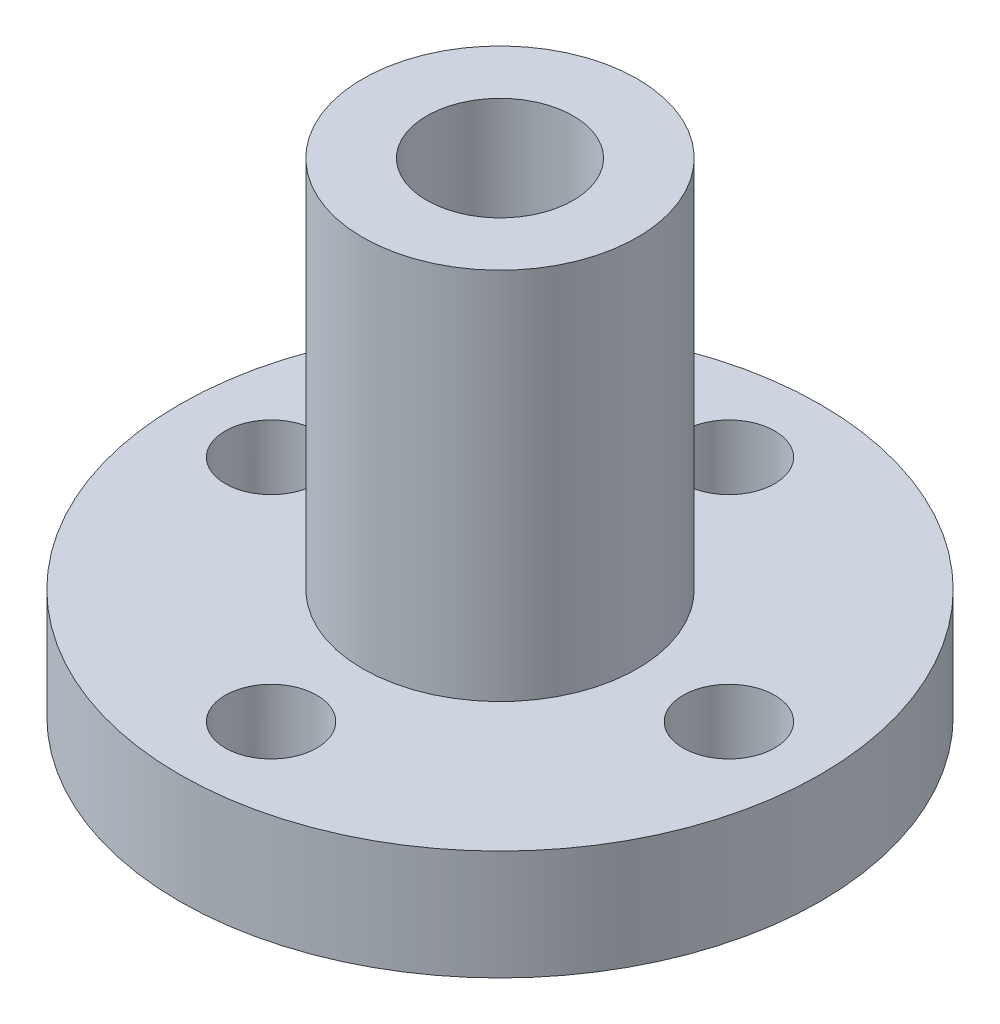
ISO-10303-21;
HEADER;
FILE_DESCRIPTION(('STEP AP214'),'2;1');
FILE_NAME('part.step','',(''),(''),'','','');
FILE_SCHEMA(('AUTOMOTIVE_DESIGN { 1 0 10303 214 1 1 1 1 }'));
ENDSEC;
DATA;
#1=APPLICATION_CONTEXT('core data for automotive mechanical design processes');
#2=APPLICATION_PROTOCOL_DEFINITION('international standard','automotive_design',2000,#1);
#3=PRODUCT_CONTEXT('',#1,'mechanical');
#4=PRODUCT('Part','Part','',(#3));
#5=PRODUCT_RELATED_PRODUCT_CATEGORY('part','',(#4));
#6=PRODUCT_DEFINITION_FORMATION('','',#4);
#7=PRODUCT_DEFINITION_CONTEXT('part definition',#1,'design');
#8=PRODUCT_DEFINITION('design','',#6,#7);
#9=PRODUCT_DEFINITION_SHAPE('','',#8);
#10=(LENGTH_UNIT() NAMED_UNIT(*) SI_UNIT(.MILLI.,.METRE.));
#11=(NAMED_UNIT(*) PLANE_ANGLE_UNIT() SI_UNIT($,.RADIAN.));
#12=(NAMED_UNIT(*) SI_UNIT($,.STERADIAN.) SOLID_ANGLE_UNIT());
#13=UNCERTAINTY_MEASURE_WITH_UNIT(LENGTH_MEASURE(1.E-05),#10,'distance_accuracy_value','');
#14=(GEOMETRIC_REPRESENTATION_CONTEXT(3) GLOBAL_UNCERTAINTY_ASSIGNED_CONTEXT((#13)) GLOBAL_UNIT_ASSIGNED_CONTEXT((#10,
#11,#12)) REPRESENTATION_CONTEXT('',''));
#15=CARTESIAN_POINT('',(0.,0.,0.));
#16=DIRECTION('',(0.,0.,1.));
#17=DIRECTION('',(1.,0.,0.));
#18=AXIS2_PLACEMENT_3D('',#15,#16,#17);
#19=CARTESIAN_POINT('',(0.,6.,0.));
#20=DIRECTION('',(0.,-1.,0.));
#21=DIRECTION('',(0.,0.,-1.));
#22=AXIS2_PLACEMENT_3D('',#19,#20,#21);
#23=CYLINDRICAL_SURFACE('',#22,17.5);
#24=CARTESIAN_POINT('',(0.,6.,0.));
#25=DIRECTION('',(0.,1.,0.));
#26=DIRECTION('',(0.,0.,1.));
#27=AXIS2_PLACEMENT_3D('',#24,#25,#26);
#28=CIRCLE('',#27,17.5);
#29=CARTESIAN_POINT('',(0.,6.,17.5));
#30=VERTEX_POINT('',#29);
#31=EDGE_CURVE('E46',#30,#30,#28,.T.);
#32=ORIENTED_EDGE('',*,*,#31,.F.);
#33=EDGE_LOOP('',(#32));
#34=FACE_BOUND('',#33,.T.);
#35=CARTESIAN_POINT('',(0.,0.,0.));
#36=DIRECTION('',(0.,1.,0.));
#37=DIRECTION('',(0.,0.,1.));
#38=AXIS2_PLACEMENT_3D('',#35,#36,#37);
#39=CIRCLE('',#38,17.5);
#40=CARTESIAN_POINT('',(0.,0.,17.5));
#41=VERTEX_POINT('',#40);
#42=EDGE_CURVE('E51',#41,#41,#39,.T.);
#43=ORIENTED_EDGE('',*,*,#42,.T.);
#44=EDGE_LOOP('',(#43));
#45=FACE_BOUND('',#44,.T.);
#46=ADVANCED_FACE('F39',(#34,#45),#23,.T.);
#47=CARTESIAN_POINT('',(0.,6.,0.));
#48=DIRECTION('',(0.,1.,0.));
#49=DIRECTION('',(0.,0.,1.));
#50=AXIS2_PLACEMENT_3D('',#47,#48,#49);
#51=PLANE('',#50);
#52=CARTESIAN_POINT('',(-12.5,6.,0.));
#53=DIRECTION('',(0.,1.,0.));
#54=DIRECTION('',(1.,0.,0.));
#55=AXIS2_PLACEMENT_3D('',#52,#53,#54);
#56=CIRCLE('',#55,2.5);
#57=CARTESIAN_POINT('',(-10.,6.,0.));
#58=VERTEX_POINT('',#57);
#59=EDGE_CURVE('E70',#58,#58,#56,.T.);
#60=ORIENTED_EDGE('',*,*,#59,.F.);
#61=EDGE_LOOP('',(#60));
#62=FACE_BOUND('',#61,.T.);
#63=CARTESIAN_POINT('',(0.,6.,12.5));
#64=DIRECTION('',(0.,1.,0.));
#65=DIRECTION('',(0.,0.,-1.));
#66=AXIS2_PLACEMENT_3D('',#63,#64,#65);
#67=CIRCLE('',#66,2.5);
#68=CARTESIAN_POINT('',(0.,6.,10.));
#69=VERTEX_POINT('',#68);
#70=EDGE_CURVE('E123',#69,#69,#67,.T.);
#71=ORIENTED_EDGE('',*,*,#70,.F.);
#72=EDGE_LOOP('',(#71));
#73=FACE_BOUND('',#72,.T.);
#74=CARTESIAN_POINT('',(12.5,6.,-1.30930550206618E-13));
#75=DIRECTION('',(0.,1.,0.));
#76=DIRECTION('',(-1.,0.,0.));
#77=AXIS2_PLACEMENT_3D('',#74,#75,#76);
#78=CIRCLE('',#77,2.5);
#79=CARTESIAN_POINT('',(10.,6.,-1.04744440165294E-13));
#80=VERTEX_POINT('',#79);
#81=EDGE_CURVE('E78',#80,#80,#78,.T.);
#82=ORIENTED_EDGE('',*,*,#81,.F.);
#83=EDGE_LOOP('',(#82));
#84=FACE_BOUND('',#83,.T.);
#85=CARTESIAN_POINT('',(0.,6.,-12.5));
#86=DIRECTION('',(0.,1.,0.));
#87=DIRECTION('',(0.,0.,1.));
#88=AXIS2_PLACEMENT_3D('',#85,#86,#87);
#89=CIRCLE('',#88,2.5);
#90=CARTESIAN_POINT('',(0.,6.,-10.));
#91=VERTEX_POINT('',#90);
#92=EDGE_CURVE('E64',#91,#91,#89,.T.);
#93=ORIENTED_EDGE('',*,*,#92,.F.);
#94=EDGE_LOOP('',(#93));
#95=FACE_BOUND('',#94,.T.);
#96=CARTESIAN_POINT('',(0.,6.,0.));
#97=DIRECTION('',(0.,1.,0.));
#98=DIRECTION('',(0.,0.,1.));
#99=AXIS2_PLACEMENT_3D('',#96,#97,#98);
#100=CIRCLE('',#99,7.5);
#101=CARTESIAN_POINT('',(0.,6.,7.5));
#102=VERTEX_POINT('',#101);
#103=EDGE_CURVE('E10',#102,#102,#100,.T.);
#104=ORIENTED_EDGE('',*,*,#103,.F.);
#105=EDGE_LOOP('',(#104));
#106=FACE_BOUND('',#105,.T.);
#107=ORIENTED_EDGE('',*,*,#31,.T.);
#108=EDGE_LOOP('',(#107));
#109=FACE_BOUND('',#108,.T.);
#110=ADVANCED_FACE('F104',(#62,#73,#84,#95,#106,#109),#51,.T.);
#111=CARTESIAN_POINT('',(0.,0.,0.));
#112=DIRECTION('',(0.,1.,0.));
#113=DIRECTION('',(0.,0.,1.));
#114=AXIS2_PLACEMENT_3D('',#111,#112,#113);
#115=PLANE('',#114);
#116=CARTESIAN_POINT('',(-12.5,0.,0.));
#117=DIRECTION('',(0.,1.,0.));
#118=DIRECTION('',(0.,0.,1.));
#119=AXIS2_PLACEMENT_3D('',#116,#117,#118);
#120=CIRCLE('',#119,2.5);
#121=CARTESIAN_POINT('',(-12.5,0.,2.50000000000004));
#122=VERTEX_POINT('',#121);
#123=EDGE_CURVE('E45',#122,#122,#120,.T.);
#124=ORIENTED_EDGE('',*,*,#123,.T.);
#125=EDGE_LOOP('',(#124));
#126=FACE_BOUND('',#125,.T.);
#127=CARTESIAN_POINT('',(0.,0.,12.5));
#128=DIRECTION('',(0.,1.,0.));
#129=DIRECTION('',(0.,0.,1.));
#130=AXIS2_PLACEMENT_3D('',#127,#128,#129);
#131=CIRCLE('',#130,2.5);
#132=CARTESIAN_POINT('',(0.,0.,15.));
#133=VERTEX_POINT('',#132);
#134=EDGE_CURVE('E66',#133,#133,#131,.T.);
#135=ORIENTED_EDGE('',*,*,#134,.T.);
#136=EDGE_LOOP('',(#135));
#137=FACE_BOUND('',#136,.T.);
#138=CARTESIAN_POINT('',(12.5,0.,-1.30930550206618E-13));
#139=DIRECTION('',(0.,1.,0.));
#140=DIRECTION('',(0.,0.,1.));
#141=AXIS2_PLACEMENT_3D('',#138,#139,#140);
#142=CIRCLE('',#141,2.5);
#143=CARTESIAN_POINT('',(12.5,0.,2.49999999999987));
#144=VERTEX_POINT('',#143);
#145=EDGE_CURVE('E61',#144,#144,#142,.T.);
#146=ORIENTED_EDGE('',*,*,#145,.T.);
#147=EDGE_LOOP('',(#146));
#148=FACE_BOUND('',#147,.T.);
#149=CARTESIAN_POINT('',(0.,0.,-12.5));
#150=DIRECTION('',(0.,1.,0.));
#151=DIRECTION('',(0.,0.,1.));
#152=AXIS2_PLACEMENT_3D('',#149,#150,#151);
#153=CIRCLE('',#152,2.5);
#154=CARTESIAN_POINT('',(0.,0.,-10.));
#155=VERTEX_POINT('',#154);
#156=EDGE_CURVE('E56',#155,#155,#153,.T.);
#157=ORIENTED_EDGE('',*,*,#156,.T.);
#158=EDGE_LOOP('',(#157));
#159=FACE_BOUND('',#158,.T.);
#160=CARTESIAN_POINT('',(0.,0.,0.));
#161=DIRECTION('',(0.,1.,0.));
#162=DIRECTION('',(0.,0.,1.));
#163=AXIS2_PLACEMENT_3D('',#160,#161,#162);
#164=CIRCLE('',#163,4.);
#165=CARTESIAN_POINT('',(0.,0.,4.));
#166=VERTEX_POINT('',#165);
#167=EDGE_CURVE('E85',#166,#166,#164,.T.);
#168=ORIENTED_EDGE('',*,*,#167,.T.);
#169=EDGE_LOOP('',(#168));
#170=FACE_BOUND('',#169,.T.);
#171=ORIENTED_EDGE('',*,*,#42,.F.);
#172=EDGE_LOOP('',(#171));
#173=FACE_BOUND('',#172,.T.);
#174=ADVANCED_FACE('F96',(#126,#137,#148,#159,#170,#173),#115,.F.);
#175=CARTESIAN_POINT('',(0.,26.4,0.));
#176=DIRECTION('',(0.,-1.,0.));
#177=DIRECTION('',(0.,0.,-1.));
#178=AXIS2_PLACEMENT_3D('',#175,#176,#177);
#179=CYLINDRICAL_SURFACE('',#178,7.5);
#180=CARTESIAN_POINT('',(0.,26.4,0.));
#181=DIRECTION('',(0.,1.,0.));
#182=DIRECTION('',(0.,0.,1.));
#183=AXIS2_PLACEMENT_3D('',#180,#181,#182);
#184=CIRCLE('',#183,7.5);
#185=CARTESIAN_POINT('',(0.,26.4,7.5));
#186=VERTEX_POINT('',#185);
#187=EDGE_CURVE('E53',#186,#186,#184,.T.);
#188=ORIENTED_EDGE('',*,*,#187,.F.);
#189=EDGE_LOOP('',(#188));
#190=FACE_BOUND('',#189,.T.);
#191=ORIENTED_EDGE('',*,*,#103,.T.);
#192=EDGE_LOOP('',(#191));
#193=FACE_BOUND('',#192,.T.);
#194=ADVANCED_FACE('F95',(#190,#193),#179,.T.);
#195=CARTESIAN_POINT('',(0.,26.4,0.));
#196=DIRECTION('',(0.,1.,0.));
#197=DIRECTION('',(0.,0.,1.));
#198=AXIS2_PLACEMENT_3D('',#195,#196,#197);
#199=PLANE('',#198);
#200=CARTESIAN_POINT('',(0.,26.4,0.));
#201=DIRECTION('',(0.,1.,0.));
#202=DIRECTION('',(0.,0.,1.));
#203=AXIS2_PLACEMENT_3D('',#200,#201,#202);
#204=CIRCLE('',#203,4.);
#205=CARTESIAN_POINT('',(0.,26.4,4.));
#206=VERTEX_POINT('',#205);
#207=EDGE_CURVE('E65',#206,#206,#204,.T.);
#208=ORIENTED_EDGE('',*,*,#207,.F.);
#209=EDGE_LOOP('',(#208));
#210=FACE_BOUND('',#209,.T.);
#211=ORIENTED_EDGE('',*,*,#187,.T.);
#212=EDGE_LOOP('',(#211));
#213=FACE_BOUND('',#212,.T.);
#214=ADVANCED_FACE('F88',(#210,#213),#199,.T.);
#215=CARTESIAN_POINT('',(0.,0.,0.));
#216=DIRECTION('',(0.,1.,0.));
#217=DIRECTION('',(0.,0.,1.));
#218=AXIS2_PLACEMENT_3D('',#215,#216,#217);
#219=CYLINDRICAL_SURFACE('',#218,4.);
#220=ORIENTED_EDGE('',*,*,#167,.F.);
#221=EDGE_LOOP('',(#220));
#222=FACE_BOUND('',#221,.T.);
#223=ORIENTED_EDGE('',*,*,#207,.T.);
#224=EDGE_LOOP('',(#223));
#225=FACE_BOUND('',#224,.T.);
#226=ADVANCED_FACE('F90',(#222,#225),#219,.F.);
#227=CARTESIAN_POINT('',(0.,-4.,-12.5));
#228=DIRECTION('',(0.,1.,0.));
#229=DIRECTION('',(0.,0.,1.));
#230=AXIS2_PLACEMENT_3D('',#227,#228,#229);
#231=CYLINDRICAL_SURFACE('',#230,2.5);
#232=ORIENTED_EDGE('',*,*,#92,.T.);
#233=EDGE_LOOP('',(#232));
#234=FACE_BOUND('',#233,.T.);
#235=ORIENTED_EDGE('',*,*,#156,.F.);
#236=EDGE_LOOP('',(#235));
#237=FACE_BOUND('',#236,.T.);
#238=ADVANCED_FACE('F150',(#234,#237),#231,.F.);
#239=CARTESIAN_POINT('',(12.5,-4.,-1.30930550206618E-13));
#240=DIRECTION('',(0.,1.,0.));
#241=DIRECTION('',(0.,0.,1.));
#242=AXIS2_PLACEMENT_3D('',#239,#240,#241);
#243=CYLINDRICAL_SURFACE('',#242,2.5);
#244=ORIENTED_EDGE('',*,*,#81,.T.);
#245=EDGE_LOOP('',(#244));
#246=FACE_BOUND('',#245,.T.);
#247=ORIENTED_EDGE('',*,*,#145,.F.);
#248=EDGE_LOOP('',(#247));
#249=FACE_BOUND('',#248,.T.);
#250=ADVANCED_FACE('F145',(#246,#249),#243,.F.);
#251=CARTESIAN_POINT('',(0.,-4.,12.5));
#252=DIRECTION('',(0.,1.,0.));
#253=DIRECTION('',(0.,0.,1.));
#254=AXIS2_PLACEMENT_3D('',#251,#252,#253);
#255=CYLINDRICAL_SURFACE('',#254,2.5);
#256=ORIENTED_EDGE('',*,*,#70,.T.);
#257=EDGE_LOOP('',(#256));
#258=FACE_BOUND('',#257,.T.);
#259=ORIENTED_EDGE('',*,*,#134,.F.);
#260=EDGE_LOOP('',(#259));
#261=FACE_BOUND('',#260,.T.);
#262=ADVANCED_FACE('F140',(#258,#261),#255,.F.);
#263=CARTESIAN_POINT('',(-12.5,-4.,0.));
#264=DIRECTION('',(0.,1.,0.));
#265=DIRECTION('',(0.,0.,1.));
#266=AXIS2_PLACEMENT_3D('',#263,#264,#265);
#267=CYLINDRICAL_SURFACE('',#266,2.5);
#268=ORIENTED_EDGE('',*,*,#59,.T.);
#269=EDGE_LOOP('',(#268));
#270=FACE_BOUND('',#269,.T.);
#271=ORIENTED_EDGE('',*,*,#123,.F.);
#272=EDGE_LOOP('',(#271));
#273=FACE_BOUND('',#272,.T.);
#274=ADVANCED_FACE('F133',(#270,#273),#267,.F.);
#275=CLOSED_SHELL('',(#46,#110,#174,#194,#214,#226,#238,#250,#262,#274));
#276=MANIFOLD_SOLID_BREP('B2',#275);
#277=ADVANCED_BREP_SHAPE_REPRESENTATION('',(#18,#276),#14);
#278=SHAPE_DEFINITION_REPRESENTATION(#9,#277);
ENDSEC;
END-ISO-10303-21;
